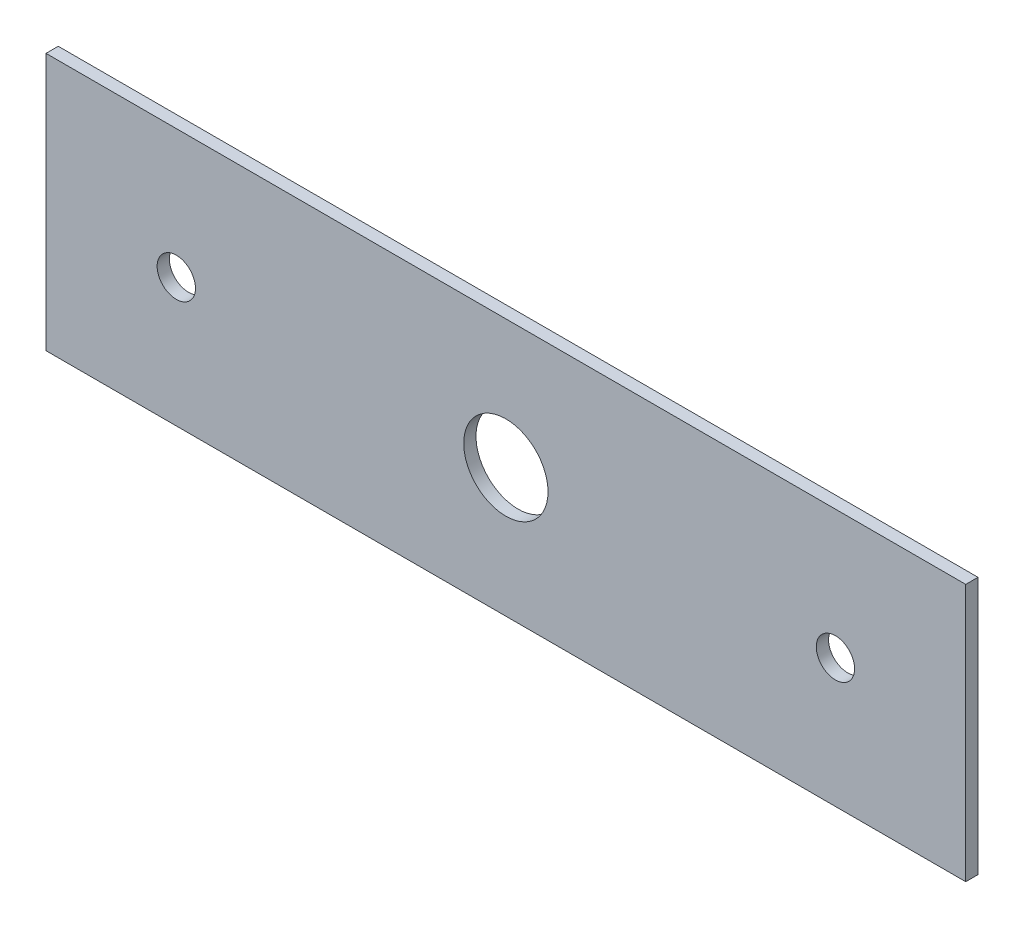
ISO-10303-21;
HEADER;
FILE_DESCRIPTION(('STEP AP214'),'2;1');
FILE_NAME('part.step','',(''),(''),'','','');
FILE_SCHEMA(('AUTOMOTIVE_DESIGN { 1 0 10303 214 1 1 1 1 }'));
ENDSEC;
DATA;
#1=APPLICATION_CONTEXT('core data for automotive mechanical design processes');
#2=APPLICATION_PROTOCOL_DEFINITION('international standard','automotive_design',2000,#1);
#3=PRODUCT_CONTEXT('',#1,'mechanical');
#4=PRODUCT('Part','Part','',(#3));
#5=PRODUCT_RELATED_PRODUCT_CATEGORY('part','',(#4));
#6=PRODUCT_DEFINITION_FORMATION('','',#4);
#7=PRODUCT_DEFINITION_CONTEXT('part definition',#1,'design');
#8=PRODUCT_DEFINITION('design','',#6,#7);
#9=PRODUCT_DEFINITION_SHAPE('','',#8);
#10=(LENGTH_UNIT() NAMED_UNIT(*) SI_UNIT(.MILLI.,.METRE.));
#11=(NAMED_UNIT(*) PLANE_ANGLE_UNIT() SI_UNIT($,.RADIAN.));
#12=(NAMED_UNIT(*) SI_UNIT($,.STERADIAN.) SOLID_ANGLE_UNIT());
#13=UNCERTAINTY_MEASURE_WITH_UNIT(LENGTH_MEASURE(1.E-05),#10,'distance_accuracy_value','');
#14=(GEOMETRIC_REPRESENTATION_CONTEXT(3) GLOBAL_UNCERTAINTY_ASSIGNED_CONTEXT((#13)) GLOBAL_UNIT_ASSIGNED_CONTEXT((#10,
#11,#12)) REPRESENTATION_CONTEXT('',''));
#15=CARTESIAN_POINT('',(0.,0.,0.));
#16=DIRECTION('',(0.,0.,1.));
#17=DIRECTION('',(1.,0.,0.));
#18=AXIS2_PLACEMENT_3D('',#15,#16,#17);
#19=CARTESIAN_POINT('',(0.,0.,1.6));
#20=DIRECTION('',(0.,0.,1.));
#21=DIRECTION('',(1.,0.,0.));
#22=AXIS2_PLACEMENT_3D('',#19,#20,#21);
#23=PLANE('',#22);
#24=CARTESIAN_POINT('',(-43.,0.,1.6));
#25=DIRECTION('',(0.,0.,1.));
#26=DIRECTION('',(1.,0.,0.));
#27=AXIS2_PLACEMENT_3D('',#24,#25,#26);
#28=CIRCLE('',#27,2.5);
#29=CARTESIAN_POINT('',(-40.5,0.,1.6));
#30=VERTEX_POINT('',#29);
#31=EDGE_CURVE('E115',#30,#30,#28,.T.);
#32=ORIENTED_EDGE('',*,*,#31,.F.);
#33=EDGE_LOOP('',(#32));
#34=FACE_BOUND('',#33,.T.);
#35=DIRECTION('',(0.,1.,0.));
#36=VECTOR('',#35,1.);
#37=CARTESIAN_POINT('',(60.,16.8,1.6));
#38=LINE('',#37,#36);
#39=CARTESIAN_POINT('',(60.,-16.8,1.6));
#40=VERTEX_POINT('',#39);
#41=CARTESIAN_POINT('',(60.,16.8,1.6));
#42=VERTEX_POINT('',#41);
#43=EDGE_CURVE('E85',#40,#42,#38,.T.);
#44=ORIENTED_EDGE('',*,*,#43,.T.);
#45=DIRECTION('',(-1.,0.,0.));
#46=VECTOR('',#45,1.);
#47=CARTESIAN_POINT('',(-60.,16.8,1.6));
#48=LINE('',#47,#46);
#49=CARTESIAN_POINT('',(-60.,16.8,1.6));
#50=VERTEX_POINT('',#49);
#51=EDGE_CURVE('E80',#42,#50,#48,.T.);
#52=ORIENTED_EDGE('',*,*,#51,.T.);
#53=DIRECTION('',(0.,-1.,0.));
#54=VECTOR('',#53,1.);
#55=CARTESIAN_POINT('',(-60.,16.8,1.6));
#56=LINE('',#55,#54);
#57=CARTESIAN_POINT('',(-60.,-16.8,1.6));
#58=VERTEX_POINT('',#57);
#59=EDGE_CURVE('E83',#50,#58,#56,.T.);
#60=ORIENTED_EDGE('',*,*,#59,.T.);
#61=DIRECTION('',(1.,0.,0.));
#62=VECTOR('',#61,1.);
#63=CARTESIAN_POINT('',(-60.,-16.8,1.6));
#64=LINE('',#63,#62);
#65=EDGE_CURVE('E50',#58,#40,#64,.T.);
#66=ORIENTED_EDGE('',*,*,#65,.T.);
#67=EDGE_LOOP('',(#44,#52,#60,#66));
#68=FACE_BOUND('',#67,.T.);
#69=CARTESIAN_POINT('',(0.,0.,1.6));
#70=DIRECTION('',(0.,0.,1.));
#71=DIRECTION('',(1.,0.,0.));
#72=AXIS2_PLACEMENT_3D('',#69,#70,#71);
#73=CIRCLE('',#72,5.5);
#74=CARTESIAN_POINT('',(5.49999999999998,0.,1.6));
#75=VERTEX_POINT('',#74);
#76=EDGE_CURVE('E100',#75,#75,#73,.T.);
#77=ORIENTED_EDGE('',*,*,#76,.F.);
#78=EDGE_LOOP('',(#77));
#79=FACE_BOUND('',#78,.T.);
#80=CARTESIAN_POINT('',(43.,0.,1.6));
#81=DIRECTION('',(0.,0.,1.));
#82=DIRECTION('',(1.,0.,0.));
#83=AXIS2_PLACEMENT_3D('',#80,#81,#82);
#84=CIRCLE('',#83,2.5);
#85=CARTESIAN_POINT('',(45.5,0.,1.6));
#86=VERTEX_POINT('',#85);
#87=EDGE_CURVE('E121',#86,#86,#84,.T.);
#88=ORIENTED_EDGE('',*,*,#87,.F.);
#89=EDGE_LOOP('',(#88));
#90=FACE_BOUND('',#89,.T.);
#91=ADVANCED_FACE('F33',(#34,#68,#79,#90),#23,.T.);
#92=CARTESIAN_POINT('',(0.,0.,0.));
#93=DIRECTION('',(0.,0.,1.));
#94=DIRECTION('',(1.,0.,0.));
#95=AXIS2_PLACEMENT_3D('',#92,#93,#94);
#96=PLANE('',#95);
#97=DIRECTION('',(0.,1.,0.));
#98=VECTOR('',#97,1.);
#99=CARTESIAN_POINT('',(60.,16.8,0.));
#100=LINE('',#99,#98);
#101=CARTESIAN_POINT('',(60.,-16.8,0.));
#102=VERTEX_POINT('',#101);
#103=CARTESIAN_POINT('',(60.,16.8,0.));
#104=VERTEX_POINT('',#103);
#105=EDGE_CURVE('E97',#102,#104,#100,.T.);
#106=ORIENTED_EDGE('',*,*,#105,.F.);
#107=DIRECTION('',(1.,0.,0.));
#108=VECTOR('',#107,1.);
#109=CARTESIAN_POINT('',(-60.,-16.8,0.));
#110=LINE('',#109,#108);
#111=CARTESIAN_POINT('',(-60.,-16.8,0.));
#112=VERTEX_POINT('',#111);
#113=EDGE_CURVE('E73',#112,#102,#110,.T.);
#114=ORIENTED_EDGE('',*,*,#113,.F.);
#115=DIRECTION('',(0.,-1.,0.));
#116=VECTOR('',#115,1.);
#117=CARTESIAN_POINT('',(-60.,16.8,0.));
#118=LINE('',#117,#116);
#119=CARTESIAN_POINT('',(-60.,16.8,0.));
#120=VERTEX_POINT('',#119);
#121=EDGE_CURVE('E67',#120,#112,#118,.T.);
#122=ORIENTED_EDGE('',*,*,#121,.F.);
#123=DIRECTION('',(-1.,0.,0.));
#124=VECTOR('',#123,1.);
#125=CARTESIAN_POINT('',(-60.,16.8,0.));
#126=LINE('',#125,#124);
#127=EDGE_CURVE('E89',#104,#120,#126,.T.);
#128=ORIENTED_EDGE('',*,*,#127,.F.);
#129=EDGE_LOOP('',(#106,#114,#122,#128));
#130=FACE_BOUND('',#129,.T.);
#131=CARTESIAN_POINT('',(0.,0.,0.));
#132=DIRECTION('',(0.,0.,1.));
#133=DIRECTION('',(1.,0.,0.));
#134=AXIS2_PLACEMENT_3D('',#131,#132,#133);
#135=CIRCLE('',#134,5.5);
#136=CARTESIAN_POINT('',(5.49999999999998,0.,0.));
#137=VERTEX_POINT('',#136);
#138=EDGE_CURVE('E112',#137,#137,#135,.T.);
#139=ORIENTED_EDGE('',*,*,#138,.T.);
#140=EDGE_LOOP('',(#139));
#141=FACE_BOUND('',#140,.T.);
#142=CARTESIAN_POINT('',(-43.,0.,0.));
#143=DIRECTION('',(0.,0.,1.));
#144=DIRECTION('',(1.,0.,0.));
#145=AXIS2_PLACEMENT_3D('',#142,#143,#144);
#146=CIRCLE('',#145,2.5);
#147=CARTESIAN_POINT('',(-40.5,0.,0.));
#148=VERTEX_POINT('',#147);
#149=EDGE_CURVE('E118',#148,#148,#146,.T.);
#150=ORIENTED_EDGE('',*,*,#149,.T.);
#151=EDGE_LOOP('',(#150));
#152=FACE_BOUND('',#151,.T.);
#153=CARTESIAN_POINT('',(43.,0.,0.));
#154=DIRECTION('',(0.,0.,1.));
#155=DIRECTION('',(1.,0.,0.));
#156=AXIS2_PLACEMENT_3D('',#153,#154,#155);
#157=CIRCLE('',#156,2.5);
#158=CARTESIAN_POINT('',(45.5,0.,0.));
#159=VERTEX_POINT('',#158);
#160=EDGE_CURVE('E124',#159,#159,#157,.T.);
#161=ORIENTED_EDGE('',*,*,#160,.T.);
#162=EDGE_LOOP('',(#161));
#163=FACE_BOUND('',#162,.T.);
#164=ADVANCED_FACE('F108',(#130,#141,#152,#163),#96,.F.);
#165=CARTESIAN_POINT('',(60.,16.8,1.6));
#166=DIRECTION('',(-1.,0.,0.));
#167=DIRECTION('',(0.,-1.,0.));
#168=AXIS2_PLACEMENT_3D('',#165,#166,#167);
#169=PLANE('',#168);
#170=ORIENTED_EDGE('',*,*,#105,.T.);
#171=DIRECTION('',(0.,0.,-1.));
#172=VECTOR('',#171,1.);
#173=CARTESIAN_POINT('',(60.,16.8,1.6));
#174=LINE('',#173,#172);
#175=EDGE_CURVE('E11',#42,#104,#174,.T.);
#176=ORIENTED_EDGE('',*,*,#175,.F.);
#177=ORIENTED_EDGE('',*,*,#43,.F.);
#178=DIRECTION('',(0.,0.,-1.));
#179=VECTOR('',#178,1.);
#180=CARTESIAN_POINT('',(60.,-16.8,1.6));
#181=LINE('',#180,#179);
#182=EDGE_CURVE('E93',#40,#102,#181,.T.);
#183=ORIENTED_EDGE('',*,*,#182,.T.);
#184=EDGE_LOOP('',(#170,#176,#177,#183));
#185=FACE_BOUND('',#184,.T.);
#186=ADVANCED_FACE('F35',(#185),#169,.F.);
#187=CARTESIAN_POINT('',(-60.,16.8,1.6));
#188=DIRECTION('',(0.,-1.,0.));
#189=DIRECTION('',(0.,0.,-1.));
#190=AXIS2_PLACEMENT_3D('',#187,#188,#189);
#191=PLANE('',#190);
#192=ORIENTED_EDGE('',*,*,#127,.T.);
#193=DIRECTION('',(0.,0.,-1.));
#194=VECTOR('',#193,1.);
#195=CARTESIAN_POINT('',(-60.,16.8,1.6));
#196=LINE('',#195,#194);
#197=EDGE_CURVE('E42',#50,#120,#196,.T.);
#198=ORIENTED_EDGE('',*,*,#197,.F.);
#199=ORIENTED_EDGE('',*,*,#51,.F.);
#200=ORIENTED_EDGE('',*,*,#175,.T.);
#201=EDGE_LOOP('',(#192,#198,#199,#200));
#202=FACE_BOUND('',#201,.T.);
#203=ADVANCED_FACE('F88',(#202),#191,.F.);
#204=CARTESIAN_POINT('',(-60.,16.8,1.6));
#205=DIRECTION('',(1.,0.,0.));
#206=DIRECTION('',(0.,1.,0.));
#207=AXIS2_PLACEMENT_3D('',#204,#205,#206);
#208=PLANE('',#207);
#209=ORIENTED_EDGE('',*,*,#121,.T.);
#210=DIRECTION('',(0.,0.,-1.));
#211=VECTOR('',#210,1.);
#212=CARTESIAN_POINT('',(-60.,-16.8,1.6));
#213=LINE('',#212,#211);
#214=EDGE_CURVE('E90',#58,#112,#213,.T.);
#215=ORIENTED_EDGE('',*,*,#214,.F.);
#216=ORIENTED_EDGE('',*,*,#59,.F.);
#217=ORIENTED_EDGE('',*,*,#197,.T.);
#218=EDGE_LOOP('',(#209,#215,#216,#217));
#219=FACE_BOUND('',#218,.T.);
#220=ADVANCED_FACE('F91',(#219),#208,.F.);
#221=CARTESIAN_POINT('',(-60.,-16.8,1.6));
#222=DIRECTION('',(0.,1.,0.));
#223=DIRECTION('',(0.,0.,1.));
#224=AXIS2_PLACEMENT_3D('',#221,#222,#223);
#225=PLANE('',#224);
#226=ORIENTED_EDGE('',*,*,#113,.T.);
#227=ORIENTED_EDGE('',*,*,#182,.F.);
#228=ORIENTED_EDGE('',*,*,#65,.F.);
#229=ORIENTED_EDGE('',*,*,#214,.T.);
#230=EDGE_LOOP('',(#226,#227,#228,#229));
#231=FACE_BOUND('',#230,.T.);
#232=ADVANCED_FACE('F105',(#231),#225,.F.);
#233=CARTESIAN_POINT('',(0.,0.,1.6));
#234=DIRECTION('',(0.,0.,-1.));
#235=DIRECTION('',(-1.,0.,0.));
#236=AXIS2_PLACEMENT_3D('',#233,#234,#235);
#237=CYLINDRICAL_SURFACE('',#236,5.5);
#238=ORIENTED_EDGE('',*,*,#76,.T.);
#239=EDGE_LOOP('',(#238));
#240=FACE_BOUND('',#239,.T.);
#241=ORIENTED_EDGE('',*,*,#138,.F.);
#242=EDGE_LOOP('',(#241));
#243=FACE_BOUND('',#242,.T.);
#244=ADVANCED_FACE('F142',(#240,#243),#237,.F.);
#245=CARTESIAN_POINT('',(-43.,0.,1.6));
#246=DIRECTION('',(0.,0.,-1.));
#247=DIRECTION('',(-1.,0.,0.));
#248=AXIS2_PLACEMENT_3D('',#245,#246,#247);
#249=CYLINDRICAL_SURFACE('',#248,2.5);
#250=ORIENTED_EDGE('',*,*,#31,.T.);
#251=EDGE_LOOP('',(#250));
#252=FACE_BOUND('',#251,.T.);
#253=ORIENTED_EDGE('',*,*,#149,.F.);
#254=EDGE_LOOP('',(#253));
#255=FACE_BOUND('',#254,.T.);
#256=ADVANCED_FACE('F188',(#252,#255),#249,.F.);
#257=CARTESIAN_POINT('',(43.,0.,1.6));
#258=DIRECTION('',(0.,0.,-1.));
#259=DIRECTION('',(-1.,0.,0.));
#260=AXIS2_PLACEMENT_3D('',#257,#258,#259);
#261=CYLINDRICAL_SURFACE('',#260,2.5);
#262=ORIENTED_EDGE('',*,*,#87,.T.);
#263=EDGE_LOOP('',(#262));
#264=FACE_BOUND('',#263,.T.);
#265=ORIENTED_EDGE('',*,*,#160,.F.);
#266=EDGE_LOOP('',(#265));
#267=FACE_BOUND('',#266,.T.);
#268=ADVANCED_FACE('F130',(#264,#267),#261,.F.);
#269=CLOSED_SHELL('',(#91,#164,#186,#203,#220,#232,#244,#256,#268));
#270=MANIFOLD_SOLID_BREP('B2',#269);
#271=ADVANCED_BREP_SHAPE_REPRESENTATION('',(#18,#270),#14);
#272=SHAPE_DEFINITION_REPRESENTATION(#9,#271);
ENDSEC;
END-ISO-10303-21;
